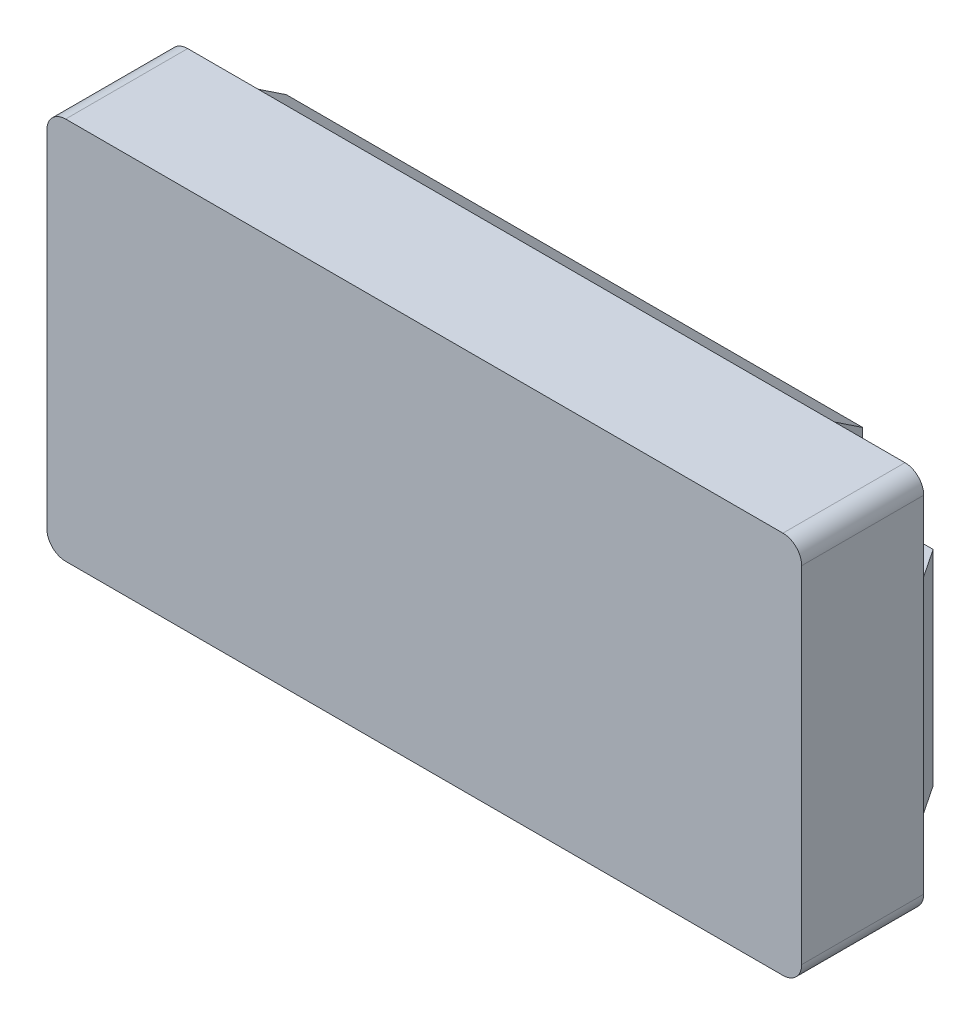
ISO-10303-21;
HEADER;
FILE_DESCRIPTION(('STEP AP214'),'2;1');
FILE_NAME('part.step','',(''),(''),'','','');
FILE_SCHEMA(('AUTOMOTIVE_DESIGN { 1 0 10303 214 1 1 1 1 }'));
ENDSEC;
DATA;
#1=APPLICATION_CONTEXT('core data for automotive mechanical design processes');
#2=APPLICATION_PROTOCOL_DEFINITION('international standard','automotive_design',2000,#1);
#3=PRODUCT_CONTEXT('',#1,'mechanical');
#4=PRODUCT('Part','Part','',(#3));
#5=PRODUCT_RELATED_PRODUCT_CATEGORY('part','',(#4));
#6=PRODUCT_DEFINITION_FORMATION('','',#4);
#7=PRODUCT_DEFINITION_CONTEXT('part definition',#1,'design');
#8=PRODUCT_DEFINITION('design','',#6,#7);
#9=PRODUCT_DEFINITION_SHAPE('','',#8);
#10=(LENGTH_UNIT() NAMED_UNIT(*) SI_UNIT(.MILLI.,.METRE.));
#11=(NAMED_UNIT(*) PLANE_ANGLE_UNIT() SI_UNIT($,.RADIAN.));
#12=(NAMED_UNIT(*) SI_UNIT($,.STERADIAN.) SOLID_ANGLE_UNIT());
#13=UNCERTAINTY_MEASURE_WITH_UNIT(LENGTH_MEASURE(1.E-05),#10,'distance_accuracy_value','');
#14=(GEOMETRIC_REPRESENTATION_CONTEXT(3) GLOBAL_UNCERTAINTY_ASSIGNED_CONTEXT((#13)) GLOBAL_UNIT_ASSIGNED_CONTEXT((#10,
#11,#12)) REPRESENTATION_CONTEXT('',''));
#15=CARTESIAN_POINT('',(0.,0.,0.));
#16=DIRECTION('',(0.,0.,1.));
#17=DIRECTION('',(1.,0.,0.));
#18=AXIS2_PLACEMENT_3D('',#15,#16,#17);
#19=CARTESIAN_POINT('',(-7.85,-7.95,-44.3));
#20=DIRECTION('',(0.,0.,-1.));
#21=DIRECTION('',(-1.,0.,0.));
#22=AXIS2_PLACEMENT_3D('',#19,#20,#21);
#23=CYLINDRICAL_SURFACE('',#22,2.5);
#24=DIRECTION('',(0.,0.,-1.));
#25=VECTOR('',#24,1.);
#26=CARTESIAN_POINT('',(-5.35,-7.95,-44.3));
#27=LINE('',#26,#25);
#28=CARTESIAN_POINT('',(-5.35,-7.95,-45.8));
#29=VERTEX_POINT('',#28);
#30=CARTESIAN_POINT('',(-5.35,-7.95,-44.3));
#31=VERTEX_POINT('',#30);
#32=EDGE_CURVE('E138',#29,#31,#27,.F.);
#33=ORIENTED_EDGE('',*,*,#32,.T.);
#34=CARTESIAN_POINT('',(-7.85,-7.95,-44.3));
#35=DIRECTION('',(0.,0.,-1.));
#36=DIRECTION('',(-1.,0.,0.));
#37=AXIS2_PLACEMENT_3D('',#34,#35,#36);
#38=CIRCLE('',#37,2.5);
#39=CARTESIAN_POINT('',(-7.85,-5.45,-44.3));
#40=VERTEX_POINT('',#39);
#41=EDGE_CURVE('E249',#31,#40,#38,.F.);
#42=ORIENTED_EDGE('',*,*,#41,.T.);
#43=DIRECTION('',(0.,0.,1.));
#44=VECTOR('',#43,1.);
#45=CARTESIAN_POINT('',(-7.85,-5.45,-44.3));
#46=LINE('',#45,#44);
#47=CARTESIAN_POINT('',(-7.85,-5.45,-45.8));
#48=VERTEX_POINT('',#47);
#49=EDGE_CURVE('E134',#40,#48,#46,.F.);
#50=ORIENTED_EDGE('',*,*,#49,.T.);
#51=CARTESIAN_POINT('',(-7.85,-7.95,-45.8));
#52=DIRECTION('',(0.,0.,-1.));
#53=DIRECTION('',(-1.,0.,0.));
#54=AXIS2_PLACEMENT_3D('',#51,#52,#53);
#55=CIRCLE('',#54,2.5);
#56=EDGE_CURVE('E20',#48,#29,#55,.T.);
#57=ORIENTED_EDGE('',*,*,#56,.T.);
#58=EDGE_LOOP('',(#33,#42,#50,#57));
#59=FACE_BOUND('',#58,.T.);
#60=ADVANCED_FACE('F17',(#59),#23,.F.);
#61=CARTESIAN_POINT('',(-12.85,-5.45,-44.3));
#62=DIRECTION('',(0.,1.,0.));
#63=DIRECTION('',(-1.,0.,0.));
#64=AXIS2_PLACEMENT_3D('',#61,#62,#63);
#65=PLANE('',#64);
#66=DIRECTION('',(-0.554700196225226,0.,0.832050294337845));
#67=VECTOR('',#66,1.);
#68=CARTESIAN_POINT('',(-9.1,-5.45,-45.8));
#69=LINE('',#68,#67);
#70=CARTESIAN_POINT('',(-9.1,-5.45,-45.8));
#71=VERTEX_POINT('',#70);
#72=CARTESIAN_POINT('',(-10.1,-5.45,-44.3));
#73=VERTEX_POINT('',#72);
#74=EDGE_CURVE('E283',#71,#73,#69,.T.);
#75=ORIENTED_EDGE('',*,*,#74,.F.);
#76=DIRECTION('',(1.,0.,0.));
#77=VECTOR('',#76,1.);
#78=CARTESIAN_POINT('',(0.,-5.45,-45.8));
#79=LINE('',#78,#77);
#80=EDGE_CURVE('E210',#71,#48,#79,.T.);
#81=ORIENTED_EDGE('',*,*,#80,.T.);
#82=ORIENTED_EDGE('',*,*,#49,.F.);
#83=DIRECTION('',(1.,0.,0.));
#84=VECTOR('',#83,1.);
#85=CARTESIAN_POINT('',(-12.85,-5.45,-44.3));
#86=LINE('',#85,#84);
#87=EDGE_CURVE('E251',#40,#73,#86,.F.);
#88=ORIENTED_EDGE('',*,*,#87,.T.);
#89=EDGE_LOOP('',(#75,#81,#82,#88));
#90=FACE_BOUND('',#89,.T.);
#91=ADVANCED_FACE('F551',(#90),#65,.F.);
#92=CARTESIAN_POINT('',(-5.35,-12.95,-44.3));
#93=DIRECTION('',(1.,0.,0.));
#94=DIRECTION('',(0.,0.,-1.));
#95=AXIS2_PLACEMENT_3D('',#92,#93,#94);
#96=PLANE('',#95);
#97=DIRECTION('',(0.,0.554700196225227,-0.832050294337845));
#98=VECTOR('',#97,1.);
#99=CARTESIAN_POINT('',(-5.35,-9.2,-45.8));
#100=LINE('',#99,#98);
#101=CARTESIAN_POINT('',(-5.35,-10.2,-44.3));
#102=VERTEX_POINT('',#101);
#103=CARTESIAN_POINT('',(-5.35,-9.2,-45.8));
#104=VERTEX_POINT('',#103);
#105=EDGE_CURVE('E202',#102,#104,#100,.T.);
#106=ORIENTED_EDGE('',*,*,#105,.F.);
#107=DIRECTION('',(0.,1.,0.));
#108=VECTOR('',#107,1.);
#109=CARTESIAN_POINT('',(-5.35,-7.95,-44.3));
#110=LINE('',#109,#108);
#111=EDGE_CURVE('E151',#102,#31,#110,.T.);
#112=ORIENTED_EDGE('',*,*,#111,.T.);
#113=ORIENTED_EDGE('',*,*,#32,.F.);
#114=DIRECTION('',(0.,1.,0.));
#115=VECTOR('',#114,1.);
#116=CARTESIAN_POINT('',(-5.35,0.,-45.8));
#117=LINE('',#116,#115);
#118=EDGE_CURVE('E143',#29,#104,#117,.F.);
#119=ORIENTED_EDGE('',*,*,#118,.T.);
#120=EDGE_LOOP('',(#106,#112,#113,#119));
#121=FACE_BOUND('',#120,.T.);
#122=ADVANCED_FACE('F148',(#121),#96,.F.);
#123=CARTESIAN_POINT('',(27.85,-7.95,-44.3));
#124=DIRECTION('',(0.,0.,-1.));
#125=DIRECTION('',(-1.,0.,0.));
#126=AXIS2_PLACEMENT_3D('',#123,#124,#125);
#127=CYLINDRICAL_SURFACE('',#126,2.5);
#128=DIRECTION('',(0.,0.,1.));
#129=VECTOR('',#128,1.);
#130=CARTESIAN_POINT('',(27.85,-5.45,-44.3));
#131=LINE('',#130,#129);
#132=CARTESIAN_POINT('',(27.85,-5.45,-44.3));
#133=VERTEX_POINT('',#132);
#134=CARTESIAN_POINT('',(27.85,-5.45,-45.8));
#135=VERTEX_POINT('',#134);
#136=EDGE_CURVE('E187',#133,#135,#131,.F.);
#137=ORIENTED_EDGE('',*,*,#136,.F.);
#138=CARTESIAN_POINT('',(27.85,-7.95,-44.3));
#139=DIRECTION('',(0.,0.,-1.));
#140=DIRECTION('',(-1.,0.,0.));
#141=AXIS2_PLACEMENT_3D('',#138,#139,#140);
#142=CIRCLE('',#141,2.5);
#143=CARTESIAN_POINT('',(25.35,-7.95,-44.3));
#144=VERTEX_POINT('',#143);
#145=EDGE_CURVE('E241',#133,#144,#142,.F.);
#146=ORIENTED_EDGE('',*,*,#145,.T.);
#147=DIRECTION('',(0.,0.,-1.));
#148=VECTOR('',#147,1.);
#149=CARTESIAN_POINT('',(25.35,-7.95,-44.3));
#150=LINE('',#149,#148);
#151=CARTESIAN_POINT('',(25.35,-7.95,-45.8));
#152=VERTEX_POINT('',#151);
#153=EDGE_CURVE('E153',#152,#144,#150,.F.);
#154=ORIENTED_EDGE('',*,*,#153,.F.);
#155=CARTESIAN_POINT('',(27.85,-7.95,-45.8));
#156=DIRECTION('',(0.,0.,-1.));
#157=DIRECTION('',(-1.,0.,0.));
#158=AXIS2_PLACEMENT_3D('',#155,#156,#157);
#159=CIRCLE('',#158,2.5);
#160=EDGE_CURVE('E164',#152,#135,#159,.T.);
#161=ORIENTED_EDGE('',*,*,#160,.T.);
#162=EDGE_LOOP('',(#137,#146,#154,#161));
#163=FACE_BOUND('',#162,.T.);
#164=ADVANCED_FACE('F558',(#163),#127,.F.);
#165=CARTESIAN_POINT('',(25.35,-12.95,-44.3));
#166=DIRECTION('',(1.,0.,0.));
#167=DIRECTION('',(0.,0.,-1.));
#168=AXIS2_PLACEMENT_3D('',#165,#166,#167);
#169=PLANE('',#168);
#170=DIRECTION('',(0.,1.,0.));
#171=VECTOR('',#170,1.);
#172=CARTESIAN_POINT('',(25.35,0.,-45.8));
#173=LINE('',#172,#171);
#174=CARTESIAN_POINT('',(25.35,-9.2,-45.8));
#175=VERTEX_POINT('',#174);
#176=EDGE_CURVE('E161',#175,#152,#173,.T.);
#177=ORIENTED_EDGE('',*,*,#176,.T.);
#178=ORIENTED_EDGE('',*,*,#153,.T.);
#179=DIRECTION('',(0.,1.,0.));
#180=VECTOR('',#179,1.);
#181=CARTESIAN_POINT('',(25.35,-7.95,-44.3));
#182=LINE('',#181,#180);
#183=CARTESIAN_POINT('',(25.35,-10.2,-44.3));
#184=VERTEX_POINT('',#183);
#185=EDGE_CURVE('E243',#144,#184,#182,.F.);
#186=ORIENTED_EDGE('',*,*,#185,.T.);
#187=DIRECTION('',(0.,0.554700196225227,-0.832050294337845));
#188=VECTOR('',#187,1.);
#189=CARTESIAN_POINT('',(25.35,-9.2,-45.8));
#190=LINE('',#189,#188);
#191=EDGE_CURVE('E314',#175,#184,#190,.F.);
#192=ORIENTED_EDGE('',*,*,#191,.F.);
#193=EDGE_LOOP('',(#177,#178,#186,#192));
#194=FACE_BOUND('',#193,.T.);
#195=ADVANCED_FACE('F615',(#194),#169,.T.);
#196=CARTESIAN_POINT('',(32.85,-5.45,-44.3));
#197=DIRECTION('',(0.,-1.,0.));
#198=DIRECTION('',(1.,0.,0.));
#199=AXIS2_PLACEMENT_3D('',#196,#197,#198);
#200=PLANE('',#199);
#201=DIRECTION('',(1.,0.,0.));
#202=VECTOR('',#201,1.);
#203=CARTESIAN_POINT('',(32.85,-5.45,-44.3));
#204=LINE('',#203,#202);
#205=CARTESIAN_POINT('',(30.1,-5.45,-44.3));
#206=VERTEX_POINT('',#205);
#207=EDGE_CURVE('E244',#206,#133,#204,.F.);
#208=ORIENTED_EDGE('',*,*,#207,.T.);
#209=ORIENTED_EDGE('',*,*,#136,.T.);
#210=DIRECTION('',(1.,0.,0.));
#211=VECTOR('',#210,1.);
#212=CARTESIAN_POINT('',(0.,-5.45,-45.8));
#213=LINE('',#212,#211);
#214=CARTESIAN_POINT('',(29.1,-5.45,-45.8));
#215=VERTEX_POINT('',#214);
#216=EDGE_CURVE('E256',#135,#215,#213,.T.);
#217=ORIENTED_EDGE('',*,*,#216,.T.);
#218=DIRECTION('',(-0.554700196225226,0.,-0.832050294337845));
#219=VECTOR('',#218,1.);
#220=CARTESIAN_POINT('',(29.1,-5.45,-45.8));
#221=LINE('',#220,#219);
#222=EDGE_CURVE('E193',#206,#215,#221,.T.);
#223=ORIENTED_EDGE('',*,*,#222,.F.);
#224=EDGE_LOOP('',(#208,#209,#217,#223));
#225=FACE_BOUND('',#224,.T.);
#226=ADVANCED_FACE('F612',(#225),#200,.T.);
#227=CARTESIAN_POINT('',(27.85,7.95,-44.3));
#228=DIRECTION('',(0.,0.,-1.));
#229=DIRECTION('',(-1.,0.,0.));
#230=AXIS2_PLACEMENT_3D('',#227,#228,#229);
#231=CYLINDRICAL_SURFACE('',#230,2.5);
#232=DIRECTION('',(0.,0.,1.));
#233=VECTOR('',#232,1.);
#234=CARTESIAN_POINT('',(25.35,7.95,-44.3));
#235=LINE('',#234,#233);
#236=CARTESIAN_POINT('',(25.35,7.95,-45.8));
#237=VERTEX_POINT('',#236);
#238=CARTESIAN_POINT('',(25.35,7.95,-44.3));
#239=VERTEX_POINT('',#238);
#240=EDGE_CURVE('E144',#237,#239,#235,.T.);
#241=ORIENTED_EDGE('',*,*,#240,.T.);
#242=CARTESIAN_POINT('',(27.85,7.95,-44.3));
#243=DIRECTION('',(0.,0.,-1.));
#244=DIRECTION('',(-1.,0.,0.));
#245=AXIS2_PLACEMENT_3D('',#242,#243,#244);
#246=CIRCLE('',#245,2.5);
#247=CARTESIAN_POINT('',(27.85,5.45,-44.3));
#248=VERTEX_POINT('',#247);
#249=EDGE_CURVE('E233',#239,#248,#246,.F.);
#250=ORIENTED_EDGE('',*,*,#249,.T.);
#251=DIRECTION('',(0.,0.,1.));
#252=VECTOR('',#251,1.);
#253=CARTESIAN_POINT('',(27.85,5.45,-44.3));
#254=LINE('',#253,#252);
#255=CARTESIAN_POINT('',(27.85,5.45,-45.8));
#256=VERTEX_POINT('',#255);
#257=EDGE_CURVE('E185',#248,#256,#254,.F.);
#258=ORIENTED_EDGE('',*,*,#257,.T.);
#259=CARTESIAN_POINT('',(27.85,7.95,-45.8));
#260=DIRECTION('',(0.,0.,-1.));
#261=DIRECTION('',(-1.,0.,0.));
#262=AXIS2_PLACEMENT_3D('',#259,#260,#261);
#263=CIRCLE('',#262,2.5);
#264=EDGE_CURVE('E253',#256,#237,#263,.T.);
#265=ORIENTED_EDGE('',*,*,#264,.T.);
#266=EDGE_LOOP('',(#241,#250,#258,#265));
#267=FACE_BOUND('',#266,.T.);
#268=ADVANCED_FACE('F542',(#267),#231,.F.);
#269=CARTESIAN_POINT('',(32.85,5.45,-44.3));
#270=DIRECTION('',(0.,-1.,0.));
#271=DIRECTION('',(1.,0.,0.));
#272=AXIS2_PLACEMENT_3D('',#269,#270,#271);
#273=PLANE('',#272);
#274=DIRECTION('',(-0.554700196225226,0.,-0.832050294337845));
#275=VECTOR('',#274,1.);
#276=CARTESIAN_POINT('',(29.1,5.45,-45.8));
#277=LINE('',#276,#275);
#278=CARTESIAN_POINT('',(29.1,5.45,-45.8));
#279=VERTEX_POINT('',#278);
#280=CARTESIAN_POINT('',(30.1,5.45,-44.3));
#281=VERTEX_POINT('',#280);
#282=EDGE_CURVE('E347',#279,#281,#277,.F.);
#283=ORIENTED_EDGE('',*,*,#282,.F.);
#284=DIRECTION('',(1.,0.,0.));
#285=VECTOR('',#284,1.);
#286=CARTESIAN_POINT('',(0.,5.45,-45.8));
#287=LINE('',#286,#285);
#288=EDGE_CURVE('E255',#279,#256,#287,.F.);
#289=ORIENTED_EDGE('',*,*,#288,.T.);
#290=ORIENTED_EDGE('',*,*,#257,.F.);
#291=DIRECTION('',(1.,0.,0.));
#292=VECTOR('',#291,1.);
#293=CARTESIAN_POINT('',(32.85,5.45,-44.3));
#294=LINE('',#293,#292);
#295=EDGE_CURVE('E235',#248,#281,#294,.T.);
#296=ORIENTED_EDGE('',*,*,#295,.T.);
#297=EDGE_LOOP('',(#283,#289,#290,#296));
#298=FACE_BOUND('',#297,.T.);
#299=ADVANCED_FACE('F540',(#298),#273,.F.);
#300=CARTESIAN_POINT('',(25.35,12.95,-44.3));
#301=DIRECTION('',(-1.,0.,0.));
#302=DIRECTION('',(0.,0.,1.));
#303=AXIS2_PLACEMENT_3D('',#300,#301,#302);
#304=PLANE('',#303);
#305=DIRECTION('',(0.,0.554700196225227,0.832050294337845));
#306=VECTOR('',#305,1.);
#307=CARTESIAN_POINT('',(25.35,9.2,-45.8));
#308=LINE('',#307,#306);
#309=CARTESIAN_POINT('',(25.35,10.2,-44.3));
#310=VERTEX_POINT('',#309);
#311=CARTESIAN_POINT('',(25.35,9.2,-45.8));
#312=VERTEX_POINT('',#311);
#313=EDGE_CURVE('E175',#310,#312,#308,.F.);
#314=ORIENTED_EDGE('',*,*,#313,.F.);
#315=DIRECTION('',(0.,1.,0.));
#316=VECTOR('',#315,1.);
#317=CARTESIAN_POINT('',(25.35,7.95,-44.3));
#318=LINE('',#317,#316);
#319=EDGE_CURVE('E236',#310,#239,#318,.F.);
#320=ORIENTED_EDGE('',*,*,#319,.T.);
#321=ORIENTED_EDGE('',*,*,#240,.F.);
#322=DIRECTION('',(0.,1.,0.));
#323=VECTOR('',#322,1.);
#324=CARTESIAN_POINT('',(25.35,0.,-45.8));
#325=LINE('',#324,#323);
#326=EDGE_CURVE('E254',#237,#312,#325,.T.);
#327=ORIENTED_EDGE('',*,*,#326,.T.);
#328=EDGE_LOOP('',(#314,#320,#321,#327));
#329=FACE_BOUND('',#328,.T.);
#330=ADVANCED_FACE('F501',(#329),#304,.F.);
#331=CARTESIAN_POINT('',(0.,0.,-45.8));
#332=DIRECTION('',(0.,0.,1.));
#333=DIRECTION('',(1.,0.,0.));
#334=AXIS2_PLACEMENT_3D('',#331,#332,#333);
#335=PLANE('',#334);
#336=DIRECTION('',(0.,1.,0.));
#337=VECTOR('',#336,1.);
#338=CARTESIAN_POINT('',(-9.1,0.,-45.8));
#339=LINE('',#338,#337);
#340=CARTESIAN_POINT('',(-9.1,5.45,-45.8));
#341=VERTEX_POINT('',#340);
#342=EDGE_CURVE('E213',#341,#71,#339,.F.);
#343=ORIENTED_EDGE('',*,*,#342,.F.);
#344=DIRECTION('',(-1.,0.,0.));
#345=VECTOR('',#344,1.);
#346=CARTESIAN_POINT('',(-12.85,5.45,-45.8));
#347=LINE('',#346,#345);
#348=CARTESIAN_POINT('',(-7.85,5.45,-45.8));
#349=VERTEX_POINT('',#348);
#350=EDGE_CURVE('E206',#349,#341,#347,.T.);
#351=ORIENTED_EDGE('',*,*,#350,.F.);
#352=CARTESIAN_POINT('',(-7.85,7.95,-45.8));
#353=DIRECTION('',(0.,0.,-1.));
#354=DIRECTION('',(-1.,0.,0.));
#355=AXIS2_PLACEMENT_3D('',#352,#353,#354);
#356=CIRCLE('',#355,2.5);
#357=CARTESIAN_POINT('',(-5.35,7.95,-45.8));
#358=VERTEX_POINT('',#357);
#359=EDGE_CURVE('E182',#349,#358,#356,.F.);
#360=ORIENTED_EDGE('',*,*,#359,.T.);
#361=DIRECTION('',(0.,1.,0.));
#362=VECTOR('',#361,1.);
#363=CARTESIAN_POINT('',(-5.35,12.95,-45.8));
#364=LINE('',#363,#362);
#365=CARTESIAN_POINT('',(-5.35,9.2,-45.8));
#366=VERTEX_POINT('',#365);
#367=EDGE_CURVE('E178',#366,#358,#364,.F.);
#368=ORIENTED_EDGE('',*,*,#367,.F.);
#369=DIRECTION('',(1.,0.,0.));
#370=VECTOR('',#369,1.);
#371=CARTESIAN_POINT('',(0.,9.2,-45.8));
#372=LINE('',#371,#370);
#373=EDGE_CURVE('E171',#312,#366,#372,.F.);
#374=ORIENTED_EDGE('',*,*,#373,.F.);
#375=ORIENTED_EDGE('',*,*,#326,.F.);
#376=ORIENTED_EDGE('',*,*,#264,.F.);
#377=ORIENTED_EDGE('',*,*,#288,.F.);
#378=DIRECTION('',(0.,1.,0.));
#379=VECTOR('',#378,1.);
#380=CARTESIAN_POINT('',(29.1,0.,-45.8));
#381=LINE('',#380,#379);
#382=EDGE_CURVE('E189',#215,#279,#381,.T.);
#383=ORIENTED_EDGE('',*,*,#382,.F.);
#384=ORIENTED_EDGE('',*,*,#216,.F.);
#385=ORIENTED_EDGE('',*,*,#160,.F.);
#386=ORIENTED_EDGE('',*,*,#176,.F.);
#387=DIRECTION('',(1.,0.,0.));
#388=VECTOR('',#387,1.);
#389=CARTESIAN_POINT('',(0.,-9.2,-45.8));
#390=LINE('',#389,#388);
#391=EDGE_CURVE('E159',#104,#175,#390,.T.);
#392=ORIENTED_EDGE('',*,*,#391,.F.);
#393=ORIENTED_EDGE('',*,*,#118,.F.);
#394=ORIENTED_EDGE('',*,*,#56,.F.);
#395=ORIENTED_EDGE('',*,*,#80,.F.);
#396=EDGE_LOOP('',(#343,#351,#360,#368,#374,#375,#376,#377,#383,#384,#385,#386,#392,#393,#394,#395));
#397=FACE_BOUND('',#396,.T.);
#398=ADVANCED_FACE('F156',(#397),#335,.F.);
#399=CARTESIAN_POINT('',(-12.85,5.45,-44.3));
#400=DIRECTION('',(0.,1.,0.));
#401=DIRECTION('',(-1.,0.,0.));
#402=AXIS2_PLACEMENT_3D('',#399,#400,#401);
#403=PLANE('',#402);
#404=DIRECTION('',(1.,0.,0.));
#405=VECTOR('',#404,1.);
#406=CARTESIAN_POINT('',(-12.85,5.45,-44.3));
#407=LINE('',#406,#405);
#408=CARTESIAN_POINT('',(-10.1,5.45,-44.3));
#409=VERTEX_POINT('',#408);
#410=CARTESIAN_POINT('',(-7.85,5.45,-44.3));
#411=VERTEX_POINT('',#410);
#412=EDGE_CURVE('E174',#409,#411,#407,.T.);
#413=ORIENTED_EDGE('',*,*,#412,.T.);
#414=DIRECTION('',(0.,0.,-1.));
#415=VECTOR('',#414,1.);
#416=CARTESIAN_POINT('',(-7.85,5.45,-44.3));
#417=LINE('',#416,#415);
#418=EDGE_CURVE('E209',#411,#349,#417,.T.);
#419=ORIENTED_EDGE('',*,*,#418,.T.);
#420=ORIENTED_EDGE('',*,*,#350,.T.);
#421=DIRECTION('',(-0.554700196225226,0.,0.832050294337845));
#422=VECTOR('',#421,1.);
#423=CARTESIAN_POINT('',(-9.1,5.45,-45.8));
#424=LINE('',#423,#422);
#425=EDGE_CURVE('E216',#409,#341,#424,.F.);
#426=ORIENTED_EDGE('',*,*,#425,.F.);
#427=EDGE_LOOP('',(#413,#419,#420,#426));
#428=FACE_BOUND('',#427,.T.);
#429=ADVANCED_FACE('F601',(#428),#403,.T.);
#430=CARTESIAN_POINT('',(-7.85,7.95,-44.3));
#431=DIRECTION('',(0.,0.,-1.));
#432=DIRECTION('',(-1.,0.,0.));
#433=AXIS2_PLACEMENT_3D('',#430,#431,#432);
#434=CYLINDRICAL_SURFACE('',#433,2.5);
#435=ORIENTED_EDGE('',*,*,#418,.F.);
#436=CARTESIAN_POINT('',(-7.85,7.95,-44.3));
#437=DIRECTION('',(0.,0.,-1.));
#438=DIRECTION('',(-1.,0.,0.));
#439=AXIS2_PLACEMENT_3D('',#436,#437,#438);
#440=CIRCLE('',#439,2.5);
#441=CARTESIAN_POINT('',(-5.35,7.95,-44.3));
#442=VERTEX_POINT('',#441);
#443=EDGE_CURVE('E231',#411,#442,#440,.F.);
#444=ORIENTED_EDGE('',*,*,#443,.T.);
#445=DIRECTION('',(0.,0.,1.));
#446=VECTOR('',#445,1.);
#447=CARTESIAN_POINT('',(-5.35,7.95,-44.3));
#448=LINE('',#447,#446);
#449=EDGE_CURVE('E181',#358,#442,#448,.T.);
#450=ORIENTED_EDGE('',*,*,#449,.F.);
#451=ORIENTED_EDGE('',*,*,#359,.F.);
#452=EDGE_LOOP('',(#435,#444,#450,#451));
#453=FACE_BOUND('',#452,.T.);
#454=ADVANCED_FACE('F507',(#453),#434,.F.);
#455=CARTESIAN_POINT('',(-5.35,12.95,-44.3));
#456=DIRECTION('',(-1.,0.,0.));
#457=DIRECTION('',(0.,0.,1.));
#458=AXIS2_PLACEMENT_3D('',#455,#456,#457);
#459=PLANE('',#458);
#460=ORIENTED_EDGE('',*,*,#367,.T.);
#461=ORIENTED_EDGE('',*,*,#449,.T.);
#462=DIRECTION('',(0.,1.,0.));
#463=VECTOR('',#462,1.);
#464=CARTESIAN_POINT('',(-5.35,7.95,-44.3));
#465=LINE('',#464,#463);
#466=CARTESIAN_POINT('',(-5.35,10.2,-44.3));
#467=VERTEX_POINT('',#466);
#468=EDGE_CURVE('E230',#442,#467,#465,.T.);
#469=ORIENTED_EDGE('',*,*,#468,.T.);
#470=DIRECTION('',(0.,0.554700196225227,0.832050294337845));
#471=VECTOR('',#470,1.);
#472=CARTESIAN_POINT('',(-5.35,9.2,-45.8));
#473=LINE('',#472,#471);
#474=EDGE_CURVE('E381',#366,#467,#473,.T.);
#475=ORIENTED_EDGE('',*,*,#474,.F.);
#476=EDGE_LOOP('',(#460,#461,#469,#475));
#477=FACE_BOUND('',#476,.T.);
#478=ADVANCED_FACE('F482',(#477),#459,.T.);
#479=CARTESIAN_POINT('',(-9.1,0.,-45.8));
#480=DIRECTION('',(-0.832050294337845,0.,-0.554700196225226));
#481=DIRECTION('',(-0.554700196225226,0.,0.832050294337845));
#482=AXIS2_PLACEMENT_3D('',#479,#480,#481);
#483=PLANE('',#482);
#484=ORIENTED_EDGE('',*,*,#425,.T.);
#485=ORIENTED_EDGE('',*,*,#342,.T.);
#486=ORIENTED_EDGE('',*,*,#74,.T.);
#487=DIRECTION('',(0.,1.,0.));
#488=VECTOR('',#487,1.);
#489=CARTESIAN_POINT('',(-10.1,10.2,-44.3));
#490=LINE('',#489,#488);
#491=EDGE_CURVE('E294',#409,#73,#490,.F.);
#492=ORIENTED_EDGE('',*,*,#491,.F.);
#493=EDGE_LOOP('',(#484,#485,#486,#492));
#494=FACE_BOUND('',#493,.T.);
#495=ADVANCED_FACE('F512',(#494),#483,.T.);
#496=CARTESIAN_POINT('',(-12.85,-7.95,-44.3));
#497=DIRECTION('',(0.,0.,1.));
#498=DIRECTION('',(1.,0.,0.));
#499=AXIS2_PLACEMENT_3D('',#496,#497,#498);
#500=PLANE('',#499);
#501=ORIENTED_EDGE('',*,*,#87,.F.);
#502=ORIENTED_EDGE('',*,*,#41,.F.);
#503=ORIENTED_EDGE('',*,*,#111,.F.);
#504=DIRECTION('',(1.,0.,0.));
#505=VECTOR('',#504,1.);
#506=CARTESIAN_POINT('',(-10.1,-10.2,-44.3));
#507=LINE('',#506,#505);
#508=CARTESIAN_POINT('',(-9.1,-10.2,-44.3));
#509=VERTEX_POINT('',#508);
#510=EDGE_CURVE('E328',#509,#102,#507,.T.);
#511=ORIENTED_EDGE('',*,*,#510,.F.);
#512=CARTESIAN_POINT('',(-9.1,-9.2,-44.3));
#513=DIRECTION('',(0.,0.,1.));
#514=DIRECTION('',(1.,0.,0.));
#515=AXIS2_PLACEMENT_3D('',#512,#513,#514);
#516=CIRCLE('',#515,1.);
#517=CARTESIAN_POINT('',(-10.1,-9.2,-44.3));
#518=VERTEX_POINT('',#517);
#519=EDGE_CURVE('E201',#518,#509,#516,.T.);
#520=ORIENTED_EDGE('',*,*,#519,.F.);
#521=DIRECTION('',(0.,1.,0.));
#522=VECTOR('',#521,1.);
#523=CARTESIAN_POINT('',(-10.1,10.2,-44.3));
#524=LINE('',#523,#522);
#525=EDGE_CURVE('E297',#73,#518,#524,.F.);
#526=ORIENTED_EDGE('',*,*,#525,.F.);
#527=EDGE_LOOP('',(#501,#502,#503,#511,#520,#526));
#528=FACE_BOUND('',#527,.T.);
#529=ADVANCED_FACE('F549',(#528),#500,.F.);
#530=CARTESIAN_POINT('',(0.,-9.2,-45.8));
#531=DIRECTION('',(0.,-0.832050294337845,-0.554700196225227));
#532=DIRECTION('',(0.,0.554700196225227,-0.832050294337845));
#533=AXIS2_PLACEMENT_3D('',#530,#531,#532);
#534=PLANE('',#533);
#535=ORIENTED_EDGE('',*,*,#105,.T.);
#536=ORIENTED_EDGE('',*,*,#391,.T.);
#537=ORIENTED_EDGE('',*,*,#191,.T.);
#538=DIRECTION('',(1.,0.,0.));
#539=VECTOR('',#538,1.);
#540=CARTESIAN_POINT('',(-10.1,-10.2,-44.3));
#541=LINE('',#540,#539);
#542=EDGE_CURVE('E324',#102,#184,#541,.T.);
#543=ORIENTED_EDGE('',*,*,#542,.F.);
#544=EDGE_LOOP('',(#535,#536,#537,#543));
#545=FACE_BOUND('',#544,.T.);
#546=ADVANCED_FACE('F545',(#545),#534,.T.);
#547=CARTESIAN_POINT('',(-9.1,-9.2,-90.8799290150284));
#548=DIRECTION('',(0.,0.,1.));
#549=DIRECTION('',(1.,0.,0.));
#550=AXIS2_PLACEMENT_3D('',#547,#548,#549);
#551=CYLINDRICAL_SURFACE('',#550,1.);
#552=CARTESIAN_POINT('',(-9.1,-9.2,-37.8));
#553=DIRECTION('',(0.,0.,1.));
#554=DIRECTION('',(1.,0.,0.));
#555=AXIS2_PLACEMENT_3D('',#552,#553,#554);
#556=CIRCLE('',#555,1.);
#557=CARTESIAN_POINT('',(-9.1,-10.2,-37.8));
#558=VERTEX_POINT('',#557);
#559=CARTESIAN_POINT('',(-10.1,-9.2,-37.8));
#560=VERTEX_POINT('',#559);
#561=EDGE_CURVE('E245',#558,#560,#556,.F.);
#562=ORIENTED_EDGE('',*,*,#561,.T.);
#563=DIRECTION('',(0.,0.,1.));
#564=VECTOR('',#563,1.);
#565=CARTESIAN_POINT('',(-10.1,-9.2,-90.8799290150284));
#566=LINE('',#565,#564);
#567=EDGE_CURVE('E302',#518,#560,#566,.T.);
#568=ORIENTED_EDGE('',*,*,#567,.F.);
#569=ORIENTED_EDGE('',*,*,#519,.T.);
#570=DIRECTION('',(0.,0.,-1.));
#571=VECTOR('',#570,1.);
#572=CARTESIAN_POINT('',(-9.1,-10.2,-90.8799290150284));
#573=LINE('',#572,#571);
#574=EDGE_CURVE('E372',#558,#509,#573,.T.);
#575=ORIENTED_EDGE('',*,*,#574,.F.);
#576=EDGE_LOOP('',(#562,#568,#569,#575));
#577=FACE_BOUND('',#576,.T.);
#578=ADVANCED_FACE('F522',(#577),#551,.T.);
#579=CARTESIAN_POINT('',(32.85,-7.95,-44.3));
#580=DIRECTION('',(0.,0.,1.));
#581=DIRECTION('',(1.,0.,0.));
#582=AXIS2_PLACEMENT_3D('',#579,#580,#581);
#583=PLANE('',#582);
#584=CARTESIAN_POINT('',(29.1,-9.2,-44.3));
#585=DIRECTION('',(0.,0.,1.));
#586=DIRECTION('',(1.,0.,0.));
#587=AXIS2_PLACEMENT_3D('',#584,#585,#586);
#588=CIRCLE('',#587,1.);
#589=CARTESIAN_POINT('',(29.1,-10.2,-44.3));
#590=VERTEX_POINT('',#589);
#591=CARTESIAN_POINT('',(30.1,-9.2,-44.3));
#592=VERTEX_POINT('',#591);
#593=EDGE_CURVE('E192',#590,#592,#588,.T.);
#594=ORIENTED_EDGE('',*,*,#593,.F.);
#595=DIRECTION('',(1.,0.,0.));
#596=VECTOR('',#595,1.);
#597=CARTESIAN_POINT('',(-10.1,-10.2,-44.3));
#598=LINE('',#597,#596);
#599=EDGE_CURVE('E327',#184,#590,#598,.T.);
#600=ORIENTED_EDGE('',*,*,#599,.F.);
#601=ORIENTED_EDGE('',*,*,#185,.F.);
#602=ORIENTED_EDGE('',*,*,#145,.F.);
#603=ORIENTED_EDGE('',*,*,#207,.F.);
#604=DIRECTION('',(0.,1.,0.));
#605=VECTOR('',#604,1.);
#606=CARTESIAN_POINT('',(30.1,10.2,-44.3));
#607=LINE('',#606,#605);
#608=EDGE_CURVE('E362',#592,#206,#607,.T.);
#609=ORIENTED_EDGE('',*,*,#608,.F.);
#610=EDGE_LOOP('',(#594,#600,#601,#602,#603,#609));
#611=FACE_BOUND('',#610,.T.);
#612=ADVANCED_FACE('F530',(#611),#583,.F.);
#613=CARTESIAN_POINT('',(29.1,0.,-45.8));
#614=DIRECTION('',(0.832050294337845,0.,-0.554700196225226));
#615=DIRECTION('',(-0.554700196225226,0.,-0.832050294337845));
#616=AXIS2_PLACEMENT_3D('',#613,#614,#615);
#617=PLANE('',#616);
#618=ORIENTED_EDGE('',*,*,#222,.T.);
#619=ORIENTED_EDGE('',*,*,#382,.T.);
#620=ORIENTED_EDGE('',*,*,#282,.T.);
#621=DIRECTION('',(0.,1.,0.));
#622=VECTOR('',#621,1.);
#623=CARTESIAN_POINT('',(30.1,10.2,-44.3));
#624=LINE('',#623,#622);
#625=EDGE_CURVE('E358',#206,#281,#624,.T.);
#626=ORIENTED_EDGE('',*,*,#625,.F.);
#627=EDGE_LOOP('',(#618,#619,#620,#626));
#628=FACE_BOUND('',#627,.T.);
#629=ADVANCED_FACE('F536',(#628),#617,.T.);
#630=CARTESIAN_POINT('',(29.1,-9.2,-90.8799290150284));
#631=DIRECTION('',(0.,0.,1.));
#632=DIRECTION('',(1.,0.,0.));
#633=AXIS2_PLACEMENT_3D('',#630,#631,#632);
#634=CYLINDRICAL_SURFACE('',#633,1.);
#635=CARTESIAN_POINT('',(29.1,-9.2,-37.8));
#636=DIRECTION('',(0.,0.,1.));
#637=DIRECTION('',(1.,0.,0.));
#638=AXIS2_PLACEMENT_3D('',#635,#636,#637);
#639=CIRCLE('',#638,1.);
#640=CARTESIAN_POINT('',(30.1,-9.2,-37.8));
#641=VERTEX_POINT('',#640);
#642=CARTESIAN_POINT('',(29.1,-10.2,-37.8));
#643=VERTEX_POINT('',#642);
#644=EDGE_CURVE('E237',#641,#643,#639,.F.);
#645=ORIENTED_EDGE('',*,*,#644,.T.);
#646=DIRECTION('',(0.,0.,-1.));
#647=VECTOR('',#646,1.);
#648=CARTESIAN_POINT('',(29.1,-10.2,-90.8799290150284));
#649=LINE('',#648,#647);
#650=EDGE_CURVE('E333',#590,#643,#649,.F.);
#651=ORIENTED_EDGE('',*,*,#650,.F.);
#652=ORIENTED_EDGE('',*,*,#593,.T.);
#653=DIRECTION('',(0.,0.,-1.));
#654=VECTOR('',#653,1.);
#655=CARTESIAN_POINT('',(30.1,-9.2,-90.8799290150284));
#656=LINE('',#655,#654);
#657=EDGE_CURVE('E413',#641,#592,#656,.T.);
#658=ORIENTED_EDGE('',*,*,#657,.F.);
#659=EDGE_LOOP('',(#645,#651,#652,#658));
#660=FACE_BOUND('',#659,.T.);
#661=ADVANCED_FACE('F528',(#660),#634,.T.);
#662=CARTESIAN_POINT('',(32.85,7.95,-44.3));
#663=DIRECTION('',(0.,0.,1.));
#664=DIRECTION('',(1.,0.,0.));
#665=AXIS2_PLACEMENT_3D('',#662,#663,#664);
#666=PLANE('',#665);
#667=ORIENTED_EDGE('',*,*,#295,.F.);
#668=ORIENTED_EDGE('',*,*,#249,.F.);
#669=ORIENTED_EDGE('',*,*,#319,.F.);
#670=DIRECTION('',(1.,0.,0.));
#671=VECTOR('',#670,1.);
#672=CARTESIAN_POINT('',(-10.1,10.2,-44.3));
#673=LINE('',#672,#671);
#674=CARTESIAN_POINT('',(29.1,10.2,-44.3));
#675=VERTEX_POINT('',#674);
#676=EDGE_CURVE('E396',#675,#310,#673,.F.);
#677=ORIENTED_EDGE('',*,*,#676,.F.);
#678=CARTESIAN_POINT('',(29.1,9.2,-44.3));
#679=DIRECTION('',(0.,0.,1.));
#680=DIRECTION('',(1.,0.,0.));
#681=AXIS2_PLACEMENT_3D('',#678,#679,#680);
#682=CIRCLE('',#681,1.);
#683=CARTESIAN_POINT('',(30.1,9.2,-44.3));
#684=VERTEX_POINT('',#683);
#685=EDGE_CURVE('E223',#684,#675,#682,.T.);
#686=ORIENTED_EDGE('',*,*,#685,.F.);
#687=DIRECTION('',(0.,1.,0.));
#688=VECTOR('',#687,1.);
#689=CARTESIAN_POINT('',(30.1,10.2,-44.3));
#690=LINE('',#689,#688);
#691=EDGE_CURVE('E361',#281,#684,#690,.T.);
#692=ORIENTED_EDGE('',*,*,#691,.F.);
#693=EDGE_LOOP('',(#667,#668,#669,#677,#686,#692));
#694=FACE_BOUND('',#693,.T.);
#695=ADVANCED_FACE('F497',(#694),#666,.F.);
#696=CARTESIAN_POINT('',(0.,9.2,-45.8));
#697=DIRECTION('',(0.,0.832050294337845,-0.554700196225227));
#698=DIRECTION('',(0.,0.554700196225227,0.832050294337845));
#699=AXIS2_PLACEMENT_3D('',#696,#697,#698);
#700=PLANE('',#699);
#701=ORIENTED_EDGE('',*,*,#313,.T.);
#702=ORIENTED_EDGE('',*,*,#373,.T.);
#703=ORIENTED_EDGE('',*,*,#474,.T.);
#704=DIRECTION('',(1.,0.,0.));
#705=VECTOR('',#704,1.);
#706=CARTESIAN_POINT('',(-10.1,10.2,-44.3));
#707=LINE('',#706,#705);
#708=EDGE_CURVE('E392',#310,#467,#707,.F.);
#709=ORIENTED_EDGE('',*,*,#708,.F.);
#710=EDGE_LOOP('',(#701,#702,#703,#709));
#711=FACE_BOUND('',#710,.T.);
#712=ADVANCED_FACE('F489',(#711),#700,.T.);
#713=CARTESIAN_POINT('',(-12.85,7.95,-44.3));
#714=DIRECTION('',(0.,0.,1.));
#715=DIRECTION('',(1.,0.,0.));
#716=AXIS2_PLACEMENT_3D('',#713,#714,#715);
#717=PLANE('',#716);
#718=CARTESIAN_POINT('',(-9.1,9.2,-44.3));
#719=DIRECTION('',(0.,0.,1.));
#720=DIRECTION('',(1.,0.,0.));
#721=AXIS2_PLACEMENT_3D('',#718,#719,#720);
#722=CIRCLE('',#721,1.);
#723=CARTESIAN_POINT('',(-9.1,10.2,-44.3));
#724=VERTEX_POINT('',#723);
#725=CARTESIAN_POINT('',(-10.1,9.2,-44.3));
#726=VERTEX_POINT('',#725);
#727=EDGE_CURVE('E227',#724,#726,#722,.T.);
#728=ORIENTED_EDGE('',*,*,#727,.F.);
#729=DIRECTION('',(1.,0.,0.));
#730=VECTOR('',#729,1.);
#731=CARTESIAN_POINT('',(-10.1,10.2,-44.3));
#732=LINE('',#731,#730);
#733=EDGE_CURVE('E395',#467,#724,#732,.F.);
#734=ORIENTED_EDGE('',*,*,#733,.F.);
#735=ORIENTED_EDGE('',*,*,#468,.F.);
#736=ORIENTED_EDGE('',*,*,#443,.F.);
#737=ORIENTED_EDGE('',*,*,#412,.F.);
#738=DIRECTION('',(0.,1.,0.));
#739=VECTOR('',#738,1.);
#740=CARTESIAN_POINT('',(-10.1,10.2,-44.3));
#741=LINE('',#740,#739);
#742=EDGE_CURVE('E222',#726,#409,#741,.F.);
#743=ORIENTED_EDGE('',*,*,#742,.F.);
#744=EDGE_LOOP('',(#728,#734,#735,#736,#737,#743));
#745=FACE_BOUND('',#744,.T.);
#746=ADVANCED_FACE('F491',(#745),#717,.F.);
#747=CARTESIAN_POINT('',(-9.1,9.2,-90.8799290150284));
#748=DIRECTION('',(0.,0.,1.));
#749=DIRECTION('',(1.,0.,0.));
#750=AXIS2_PLACEMENT_3D('',#747,#748,#749);
#751=CYLINDRICAL_SURFACE('',#750,1.);
#752=CARTESIAN_POINT('',(-9.1,9.2,-37.8));
#753=DIRECTION('',(0.,0.,1.));
#754=DIRECTION('',(1.,0.,0.));
#755=AXIS2_PLACEMENT_3D('',#752,#753,#754);
#756=CIRCLE('',#755,1.);
#757=CARTESIAN_POINT('',(-10.1,9.2,-37.8));
#758=VERTEX_POINT('',#757);
#759=CARTESIAN_POINT('',(-9.1,10.2,-37.8));
#760=VERTEX_POINT('',#759);
#761=EDGE_CURVE('E35',#758,#760,#756,.F.);
#762=ORIENTED_EDGE('',*,*,#761,.T.);
#763=DIRECTION('',(0.,0.,1.));
#764=VECTOR('',#763,1.);
#765=CARTESIAN_POINT('',(-9.1,10.2,-90.8799290150284));
#766=LINE('',#765,#764);
#767=EDGE_CURVE('E408',#724,#760,#766,.T.);
#768=ORIENTED_EDGE('',*,*,#767,.F.);
#769=ORIENTED_EDGE('',*,*,#727,.T.);
#770=DIRECTION('',(0.,0.,1.));
#771=VECTOR('',#770,1.);
#772=CARTESIAN_POINT('',(-10.1,9.2,-90.8799290150284));
#773=LINE('',#772,#771);
#774=EDGE_CURVE('E338',#758,#726,#773,.F.);
#775=ORIENTED_EDGE('',*,*,#774,.F.);
#776=EDGE_LOOP('',(#762,#768,#769,#775));
#777=FACE_BOUND('',#776,.T.);
#778=ADVANCED_FACE('F517',(#777),#751,.T.);
#779=CARTESIAN_POINT('',(29.1,9.2,-90.8799290150284));
#780=DIRECTION('',(0.,0.,1.));
#781=DIRECTION('',(1.,0.,0.));
#782=AXIS2_PLACEMENT_3D('',#779,#780,#781);
#783=CYLINDRICAL_SURFACE('',#782,1.);
#784=CARTESIAN_POINT('',(29.1,9.2,-37.8));
#785=DIRECTION('',(0.,0.,1.));
#786=DIRECTION('',(1.,0.,0.));
#787=AXIS2_PLACEMENT_3D('',#784,#785,#786);
#788=CIRCLE('',#787,1.);
#789=CARTESIAN_POINT('',(29.1,10.2,-37.8));
#790=VERTEX_POINT('',#789);
#791=CARTESIAN_POINT('',(30.1,9.2,-37.8));
#792=VERTEX_POINT('',#791);
#793=EDGE_CURVE('E219',#790,#792,#788,.F.);
#794=ORIENTED_EDGE('',*,*,#793,.T.);
#795=DIRECTION('',(0.,0.,-1.));
#796=VECTOR('',#795,1.);
#797=CARTESIAN_POINT('',(30.1,9.2,-90.8799290150284));
#798=LINE('',#797,#796);
#799=EDGE_CURVE('E367',#684,#792,#798,.F.);
#800=ORIENTED_EDGE('',*,*,#799,.F.);
#801=ORIENTED_EDGE('',*,*,#685,.T.);
#802=DIRECTION('',(0.,0.,1.));
#803=VECTOR('',#802,1.);
#804=CARTESIAN_POINT('',(29.1,10.2,-90.8799290150284));
#805=LINE('',#804,#803);
#806=EDGE_CURVE('E427',#790,#675,#805,.F.);
#807=ORIENTED_EDGE('',*,*,#806,.F.);
#808=EDGE_LOOP('',(#794,#800,#801,#807));
#809=FACE_BOUND('',#808,.T.);
#810=ADVANCED_FACE('F449',(#809),#783,.T.);
#811=CARTESIAN_POINT('',(-10.1,10.2,-90.8799290150284));
#812=DIRECTION('',(-1.,0.,0.));
#813=DIRECTION('',(0.,0.,1.));
#814=AXIS2_PLACEMENT_3D('',#811,#812,#813);
#815=PLANE('',#814);
#816=DIRECTION('',(0.,1.,0.));
#817=VECTOR('',#816,1.);
#818=CARTESIAN_POINT('',(-10.1,9.2,-37.8));
#819=LINE('',#818,#817);
#820=EDGE_CURVE('E430',#758,#560,#819,.F.);
#821=ORIENTED_EDGE('',*,*,#820,.F.);
#822=ORIENTED_EDGE('',*,*,#774,.T.);
#823=ORIENTED_EDGE('',*,*,#742,.T.);
#824=ORIENTED_EDGE('',*,*,#491,.T.);
#825=ORIENTED_EDGE('',*,*,#525,.T.);
#826=ORIENTED_EDGE('',*,*,#567,.T.);
#827=EDGE_LOOP('',(#821,#822,#823,#824,#825,#826));
#828=FACE_BOUND('',#827,.T.);
#829=ADVANCED_FACE('F516',(#828),#815,.T.);
#830=CARTESIAN_POINT('',(-10.1,-10.2,-90.8799290150284));
#831=DIRECTION('',(0.,-1.,0.));
#832=DIRECTION('',(0.,0.,-1.));
#833=AXIS2_PLACEMENT_3D('',#830,#831,#832);
#834=PLANE('',#833);
#835=DIRECTION('',(1.,0.,0.));
#836=VECTOR('',#835,1.);
#837=CARTESIAN_POINT('',(-9.1,-10.2,-37.8));
#838=LINE('',#837,#836);
#839=EDGE_CURVE('E433',#558,#643,#838,.T.);
#840=ORIENTED_EDGE('',*,*,#839,.F.);
#841=ORIENTED_EDGE('',*,*,#574,.T.);
#842=ORIENTED_EDGE('',*,*,#510,.T.);
#843=ORIENTED_EDGE('',*,*,#542,.T.);
#844=ORIENTED_EDGE('',*,*,#599,.T.);
#845=ORIENTED_EDGE('',*,*,#650,.T.);
#846=EDGE_LOOP('',(#840,#841,#842,#843,#844,#845));
#847=FACE_BOUND('',#846,.T.);
#848=ADVANCED_FACE('F524',(#847),#834,.T.);
#849=CARTESIAN_POINT('',(30.1,10.2,-90.8799290150284));
#850=DIRECTION('',(1.,0.,0.));
#851=DIRECTION('',(0.,0.,-1.));
#852=AXIS2_PLACEMENT_3D('',#849,#850,#851);
#853=PLANE('',#852);
#854=DIRECTION('',(0.,1.,0.));
#855=VECTOR('',#854,1.);
#856=CARTESIAN_POINT('',(30.1,9.2,-37.8));
#857=LINE('',#856,#855);
#858=EDGE_CURVE('E26',#641,#792,#857,.T.);
#859=ORIENTED_EDGE('',*,*,#858,.F.);
#860=ORIENTED_EDGE('',*,*,#657,.T.);
#861=ORIENTED_EDGE('',*,*,#608,.T.);
#862=ORIENTED_EDGE('',*,*,#625,.T.);
#863=ORIENTED_EDGE('',*,*,#691,.T.);
#864=ORIENTED_EDGE('',*,*,#799,.T.);
#865=EDGE_LOOP('',(#859,#860,#861,#862,#863,#864));
#866=FACE_BOUND('',#865,.T.);
#867=ADVANCED_FACE('F444',(#866),#853,.T.);
#868=CARTESIAN_POINT('',(-10.1,10.2,-90.8799290150284));
#869=DIRECTION('',(0.,1.,0.));
#870=DIRECTION('',(0.,0.,1.));
#871=AXIS2_PLACEMENT_3D('',#868,#869,#870);
#872=PLANE('',#871);
#873=DIRECTION('',(1.,0.,0.));
#874=VECTOR('',#873,1.);
#875=CARTESIAN_POINT('',(-9.1,10.2,-37.8));
#876=LINE('',#875,#874);
#877=EDGE_CURVE('E11',#790,#760,#876,.F.);
#878=ORIENTED_EDGE('',*,*,#877,.F.);
#879=ORIENTED_EDGE('',*,*,#806,.T.);
#880=ORIENTED_EDGE('',*,*,#676,.T.);
#881=ORIENTED_EDGE('',*,*,#708,.T.);
#882=ORIENTED_EDGE('',*,*,#733,.T.);
#883=ORIENTED_EDGE('',*,*,#767,.T.);
#884=EDGE_LOOP('',(#878,#879,#880,#881,#882,#883));
#885=FACE_BOUND('',#884,.T.);
#886=ADVANCED_FACE('F494',(#885),#872,.T.);
#887=CARTESIAN_POINT('',(-9.1,9.2,-37.8));
#888=DIRECTION('',(0.,0.,1.));
#889=DIRECTION('',(1.,0.,0.));
#890=AXIS2_PLACEMENT_3D('',#887,#888,#889);
#891=PLANE('',#890);
#892=ORIENTED_EDGE('',*,*,#877,.T.);
#893=ORIENTED_EDGE('',*,*,#761,.F.);
#894=ORIENTED_EDGE('',*,*,#820,.T.);
#895=ORIENTED_EDGE('',*,*,#561,.F.);
#896=ORIENTED_EDGE('',*,*,#839,.T.);
#897=ORIENTED_EDGE('',*,*,#644,.F.);
#898=ORIENTED_EDGE('',*,*,#858,.T.);
#899=ORIENTED_EDGE('',*,*,#793,.F.);
#900=EDGE_LOOP('',(#892,#893,#894,#895,#896,#897,#898,#899));
#901=FACE_BOUND('',#900,.T.);
#902=ADVANCED_FACE('F439',(#901),#891,.T.);
#903=CLOSED_SHELL('',(#60,#91,#122,#164,#195,#226,#268,#299,#330,#398,#429,#454,#478,#495,#529,
#546,#578,#612,#629,#661,#695,#712,#746,#778,#810,#829,#848,#867,#886,#902));
#904=MANIFOLD_SOLID_BREP('B1',#903);
#905=ADVANCED_BREP_SHAPE_REPRESENTATION('',(#18,#904),#14);
#906=SHAPE_DEFINITION_REPRESENTATION(#9,#905);
ENDSEC;
END-ISO-10303-21;
